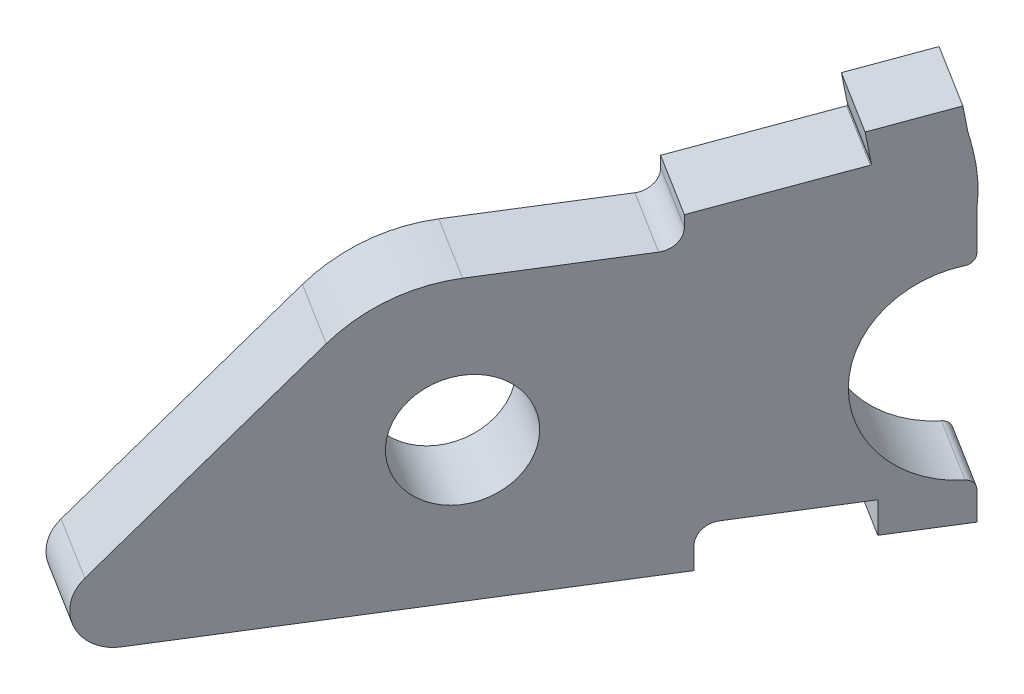
ISO-10303-21;
HEADER;
FILE_DESCRIPTION(('STEP AP214'),'2;1');
FILE_NAME('part.step','',(''),(''),'','','');
FILE_SCHEMA(('AUTOMOTIVE_DESIGN { 1 0 10303 214 1 1 1 1 }'));
ENDSEC;
DATA;
#1=APPLICATION_CONTEXT('core data for automotive mechanical design processes');
#2=APPLICATION_PROTOCOL_DEFINITION('international standard','automotive_design',2000,#1);
#3=PRODUCT_CONTEXT('',#1,'mechanical');
#4=PRODUCT('Part','Part','',(#3));
#5=PRODUCT_RELATED_PRODUCT_CATEGORY('part','',(#4));
#6=PRODUCT_DEFINITION_FORMATION('','',#4);
#7=PRODUCT_DEFINITION_CONTEXT('part definition',#1,'design');
#8=PRODUCT_DEFINITION('design','',#6,#7);
#9=PRODUCT_DEFINITION_SHAPE('','',#8);
#10=(LENGTH_UNIT() NAMED_UNIT(*) SI_UNIT(.MILLI.,.METRE.));
#11=(NAMED_UNIT(*) PLANE_ANGLE_UNIT() SI_UNIT($,.RADIAN.));
#12=(NAMED_UNIT(*) SI_UNIT($,.STERADIAN.) SOLID_ANGLE_UNIT());
#13=UNCERTAINTY_MEASURE_WITH_UNIT(LENGTH_MEASURE(1.E-05),#10,'distance_accuracy_value','');
#14=(GEOMETRIC_REPRESENTATION_CONTEXT(3) GLOBAL_UNCERTAINTY_ASSIGNED_CONTEXT((#13)) GLOBAL_UNIT_ASSIGNED_CONTEXT((#10,
#11,#12)) REPRESENTATION_CONTEXT('',''));
#15=CARTESIAN_POINT('',(0.,0.,0.));
#16=DIRECTION('',(0.,0.,1.));
#17=DIRECTION('',(1.,0.,0.));
#18=AXIS2_PLACEMENT_3D('',#15,#16,#17);
#19=CARTESIAN_POINT('',(-344.76294238982,20.4072042356306,158.663972817058));
#20=DIRECTION('',(-0.523412538698559,-0.156226295448581,0.837635158612354));
#21=DIRECTION('',(0.0827873235379901,-0.987721288932467,-0.132487412424741));
#22=AXIS2_PLACEMENT_3D('',#19,#20,#21);
#23=PLANE('',#22);
#24=DIRECTION('',(0.0827873235379901,-0.987721288932467,-0.132487412424741));
#25=VECTOR('',#24,1.);
#26=CARTESIAN_POINT('',(-351.547327159072,20.4072042356306,154.424618703192));
#27=LINE('',#26,#25);
#28=CARTESIAN_POINT('',(-353.071209475215,38.5883815120178,156.86334019191));
#29=VERTEX_POINT('',#28);
#30=CARTESIAN_POINT('',(-352.85056810026,35.95594729445,156.510240181035));
#31=VERTEX_POINT('',#30);
#32=EDGE_CURVE('E375',#29,#31,#27,.T.);
#33=ORIENTED_EDGE('',*,*,#32,.T.);
#34=DIRECTION('',(0.84804809615643,0.,0.529919264233198));
#35=VECTOR('',#34,1.);
#36=CARTESIAN_POINT('',(-346.066183331008,35.95594729445,160.7495942949));
#37=LINE('',#36,#35);
#38=CARTESIAN_POINT('',(-346.066183331008,35.95594729445,160.7495942949));
#39=VERTEX_POINT('',#38);
#40=EDGE_CURVE('E434',#31,#39,#37,.T.);
#41=ORIENTED_EDGE('',*,*,#40,.T.);
#42=DIRECTION('',(0.0827873235379901,-0.987721288932467,-0.132487412424741));
#43=VECTOR('',#42,1.);
#44=CARTESIAN_POINT('',(-344.76294238982,20.4072042356306,158.663972817058));
#45=LINE('',#44,#43);
#46=CARTESIAN_POINT('',(-346.286824705963,38.5883815120177,161.102694305776));
#47=VERTEX_POINT('',#46);
#48=EDGE_CURVE('E258',#47,#39,#45,.T.);
#49=ORIENTED_EDGE('',*,*,#48,.F.);
#50=DIRECTION('',(0.84804809615643,0.,0.529919264233198));
#51=VECTOR('',#50,1.);
#52=CARTESIAN_POINT('',(-346.286824705963,38.5883815120177,161.102694305776));
#53=LINE('',#52,#51);
#54=EDGE_CURVE('E257',#29,#47,#53,.T.);
#55=ORIENTED_EDGE('',*,*,#54,.F.);
#56=EDGE_LOOP('',(#33,#41,#49,#55));
#57=FACE_BOUND('',#56,.T.);
#58=ADVANCED_FACE('F37',(#57),#23,.T.);
#59=CARTESIAN_POINT('',(-346.429696410204,40.2929591917116,161.331336827295));
#60=DIRECTION('',(0.523284665044902,0.157744371910482,-0.837430517989052));
#61=DIRECTION('',(-0.0835917814997305,0.987479981129019,0.133774814278076));
#62=AXIS2_PLACEMENT_3D('',#59,#60,#61);
#63=PLANE('',#62);
#64=DIRECTION('',(-0.0835917814997305,0.987479981129019,0.133774814278076));
#65=VECTOR('',#64,1.);
#66=CARTESIAN_POINT('',(-353.214081179455,40.2929591917116,157.091982713429));
#67=LINE('',#66,#65);
#68=CARTESIAN_POINT('',(-352.813312544952,35.5586300921784,156.450618829478));
#69=VERTEX_POINT('',#68);
#70=CARTESIAN_POINT('',(-352.814698262123,35.574999739305,156.452836440514));
#71=VERTEX_POINT('',#70);
#72=EDGE_CURVE('E372',#69,#71,#67,.T.);
#73=ORIENTED_EDGE('',*,*,#72,.F.);
#74=DIRECTION('',(-0.848048096156431,0.,-0.529919264233198));
#75=VECTOR('',#74,1.);
#76=CARTESIAN_POINT('',(-346.028927775701,35.5586300921784,160.689972943343));
#77=LINE('',#76,#75);
#78=CARTESIAN_POINT('',(-346.028927775701,35.5586300921784,160.689972943343));
#79=VERTEX_POINT('',#78);
#80=EDGE_CURVE('E420',#69,#79,#77,.F.);
#81=ORIENTED_EDGE('',*,*,#80,.T.);
#82=DIRECTION('',(-0.0835917814997305,0.987479981129019,0.133774814278076));
#83=VECTOR('',#82,1.);
#84=CARTESIAN_POINT('',(-346.429696410204,40.2929591917116,161.331336827295));
#85=LINE('',#84,#83);
#86=CARTESIAN_POINT('',(-346.030313492872,35.574999739305,160.692190554379));
#87=VERTEX_POINT('',#86);
#88=EDGE_CURVE('E260',#79,#87,#85,.T.);
#89=ORIENTED_EDGE('',*,*,#88,.T.);
#90=DIRECTION('',(-0.848048096156431,0.,-0.529919264233198));
#91=VECTOR('',#90,1.);
#92=CARTESIAN_POINT('',(-352.814698262123,35.574999739305,156.452836440514));
#93=LINE('',#92,#91);
#94=EDGE_CURVE('E418',#87,#71,#93,.T.);
#95=ORIENTED_EDGE('',*,*,#94,.T.);
#96=EDGE_LOOP('',(#73,#81,#89,#95));
#97=FACE_BOUND('',#96,.T.);
#98=ADVANCED_FACE('F504',(#97),#63,.F.);
#99=CARTESIAN_POINT('',(-346.020555738474,35.4597301882154,160.676574883091));
#100=DIRECTION('',(0.0827873235379969,-0.987721288932464,-0.132487412424752));
#101=DIRECTION('',(0.523412538698558,0.156226295448594,-0.837635158612352));
#102=AXIS2_PLACEMENT_3D('',#99,#100,#101);
#103=PLANE('',#102);
#104=DIRECTION('',(0.523412538698558,0.156226295448594,-0.837635158612352));
#105=VECTOR('',#104,1.);
#106=CARTESIAN_POINT('',(-346.020555738474,35.4597301882154,160.676574883091));
#107=LINE('',#106,#105);
#108=CARTESIAN_POINT('',(-353.737484478112,33.1564090025366,173.026242403282));
#109=VERTEX_POINT('',#108);
#110=CARTESIAN_POINT('',(-346.072977509851,35.4440835260941,160.7604672539));
#111=VERTEX_POINT('',#110);
#112=EDGE_CURVE('E266',#109,#111,#107,.T.);
#113=ORIENTED_EDGE('',*,*,#112,.T.);
#114=DIRECTION('',(-0.848048096156431,0.,-0.529919264233198));
#115=VECTOR('',#114,1.);
#116=CARTESIAN_POINT('',(-352.857362279103,35.4440835260941,156.521113140034));
#117=LINE('',#116,#115);
#118=CARTESIAN_POINT('',(-352.857362279103,35.4440835260941,156.521113140034));
#119=VERTEX_POINT('',#118);
#120=EDGE_CURVE('E423',#111,#119,#117,.T.);
#121=ORIENTED_EDGE('',*,*,#120,.T.);
#122=DIRECTION('',(0.523412538698558,0.156226295448594,-0.837635158612352));
#123=VECTOR('',#122,1.);
#124=CARTESIAN_POINT('',(-352.804940507726,35.4597301882154,156.437220769226));
#125=LINE('',#124,#123);
#126=CARTESIAN_POINT('',(-360.521869247363,33.1564090025367,168.786888289417));
#127=VERTEX_POINT('',#126);
#128=EDGE_CURVE('E369',#127,#119,#125,.T.);
#129=ORIENTED_EDGE('',*,*,#128,.F.);
#130=DIRECTION('',(0.84804809615643,0.,0.529919264233198));
#131=VECTOR('',#130,1.);
#132=CARTESIAN_POINT('',(-353.737484478112,33.1564090025366,173.026242403282));
#133=LINE('',#132,#131);
#134=EDGE_CURVE('E408',#127,#109,#133,.T.);
#135=ORIENTED_EDGE('',*,*,#134,.T.);
#136=EDGE_LOOP('',(#113,#121,#129,#135));
#137=FACE_BOUND('',#136,.T.);
#138=ADVANCED_FACE('F514',(#137),#103,.F.);
#139=CARTESIAN_POINT('',(-353.737484478112,33.1564090025366,173.026242403282));
#140=DIRECTION('',(0.529919264233198,0.,-0.84804809615643));
#141=DIRECTION('',(0.,1.,0.));
#142=AXIS2_PLACEMENT_3D('',#139,#140,#141);
#143=PLANE('',#142);
#144=ORIENTED_EDGE('',*,*,#134,.F.);
#145=DIRECTION('',(0.,1.,0.));
#146=VECTOR('',#145,1.);
#147=CARTESIAN_POINT('',(-360.521869247363,15.,168.786888289417));
#148=LINE('',#147,#146);
#149=CARTESIAN_POINT('',(-360.521869247363,32.,168.786888289417));
#150=VERTEX_POINT('',#149);
#151=EDGE_CURVE('E366',#150,#127,#148,.T.);
#152=ORIENTED_EDGE('',*,*,#151,.F.);
#153=DIRECTION('',(0.84804809615643,0.,0.529919264233198));
#154=VECTOR('',#153,1.);
#155=CARTESIAN_POINT('',(-353.737484478112,32.,173.026242403282));
#156=LINE('',#155,#154);
#157=CARTESIAN_POINT('',(-353.737484478112,32.,173.026242403282));
#158=VERTEX_POINT('',#157);
#159=EDGE_CURVE('E406',#150,#158,#156,.T.);
#160=ORIENTED_EDGE('',*,*,#159,.T.);
#161=DIRECTION('',(0.,1.,0.));
#162=VECTOR('',#161,1.);
#163=CARTESIAN_POINT('',(-353.737484478112,33.1564090025366,173.026242403282));
#164=LINE('',#163,#162);
#165=EDGE_CURVE('E269',#158,#109,#164,.T.);
#166=ORIENTED_EDGE('',*,*,#165,.T.);
#167=EDGE_LOOP('',(#144,#152,#160,#166));
#168=FACE_BOUND('',#167,.T.);
#169=ADVANCED_FACE('F517',(#168),#143,.F.);
#170=CARTESIAN_POINT('',(-354.797323006578,32.,174.722338595595));
#171=DIRECTION('',(0.84804809615643,0.,0.529919264233198));
#172=DIRECTION('',(0.529919264233198,0.,-0.84804809615643));
#173=AXIS2_PLACEMENT_3D('',#170,#171,#172);
#174=CYLINDRICAL_SURFACE('',#173,2.);
#175=ORIENTED_EDGE('',*,*,#159,.F.);
#176=CARTESIAN_POINT('',(-361.581707775829,32.,170.482984481729));
#177=DIRECTION('',(0.84804809615643,0.,0.529919264233198));
#178=DIRECTION('',(0.529919264233198,0.,-0.84804809615643));
#179=AXIS2_PLACEMENT_3D('',#176,#177,#178);
#180=CIRCLE('',#179,2.);
#181=CARTESIAN_POINT('',(-361.581707775829,30.,170.482984481729));
#182=VERTEX_POINT('',#181);
#183=EDGE_CURVE('E363',#150,#182,#180,.F.);
#184=ORIENTED_EDGE('',*,*,#183,.T.);
#185=DIRECTION('',(0.84804809615643,0.,0.529919264233198));
#186=VECTOR('',#185,1.);
#187=CARTESIAN_POINT('',(-354.797323006578,30.,174.722338595595));
#188=LINE('',#187,#186);
#189=CARTESIAN_POINT('',(-354.797323006578,30.,174.722338595595));
#190=VERTEX_POINT('',#189);
#191=EDGE_CURVE('E404',#182,#190,#188,.T.);
#192=ORIENTED_EDGE('',*,*,#191,.T.);
#193=CARTESIAN_POINT('',(-354.797323006578,32.,174.722338595595));
#194=DIRECTION('',(0.84804809615643,0.,0.529919264233198));
#195=DIRECTION('',(0.529919264233198,0.,-0.84804809615643));
#196=AXIS2_PLACEMENT_3D('',#193,#194,#195);
#197=CIRCLE('',#196,2.);
#198=EDGE_CURVE('E272',#158,#190,#197,.F.);
#199=ORIENTED_EDGE('',*,*,#198,.F.);
#200=EDGE_LOOP('',(#175,#184,#192,#199));
#201=FACE_BOUND('',#200,.T.);
#202=ADVANCED_FACE('F522',(#201),#174,.F.);
#203=CARTESIAN_POINT('',(-341.682190561809,30.,153.733739291285));
#204=DIRECTION('',(0.,1.,0.));
#205=DIRECTION('',(-0.529919264233199,0.,0.84804809615643));
#206=AXIS2_PLACEMENT_3D('',#203,#204,#205);
#207=PLANE('',#206);
#208=ORIENTED_EDGE('',*,*,#191,.F.);
#209=DIRECTION('',(0.529919264233198,0.,-0.84804809615643));
#210=VECTOR('',#209,1.);
#211=CARTESIAN_POINT('',(-369.663345900389,30.,183.416309023677));
#212=LINE('',#211,#210);
#213=CARTESIAN_POINT('',(-369.663345900389,30.,183.416309023677));
#214=VERTEX_POINT('',#213);
#215=EDGE_CURVE('E360',#182,#214,#212,.F.);
#216=ORIENTED_EDGE('',*,*,#215,.T.);
#217=DIRECTION('',(0.84804809615643,0.,0.529919264233198));
#218=VECTOR('',#217,1.);
#219=CARTESIAN_POINT('',(-362.878961131137,30.,187.655663137542));
#220=LINE('',#219,#218);
#221=CARTESIAN_POINT('',(-362.878961131137,30.,187.655663137542));
#222=VERTEX_POINT('',#221);
#223=EDGE_CURVE('E402',#214,#222,#220,.T.);
#224=ORIENTED_EDGE('',*,*,#223,.T.);
#225=DIRECTION('',(-0.529919264233199,0.,0.84804809615643));
#226=VECTOR('',#225,1.);
#227=CARTESIAN_POINT('',(-341.682190561809,30.,153.733739291285));
#228=LINE('',#227,#226);
#229=EDGE_CURVE('E275',#190,#222,#228,.T.);
#230=ORIENTED_EDGE('',*,*,#229,.F.);
#231=EDGE_LOOP('',(#208,#216,#224,#230));
#232=FACE_BOUND('',#231,.T.);
#233=ADVANCED_FACE('F527',(#232),#207,.T.);
#234=CARTESIAN_POINT('',(-362.878961131137,15.,187.655663137542));
#235=DIRECTION('',(0.84804809615643,0.,0.529919264233198));
#236=DIRECTION('',(0.529919264233198,0.,-0.84804809615643));
#237=AXIS2_PLACEMENT_3D('',#234,#235,#236);
#238=CYLINDRICAL_SURFACE('',#237,15.);
#239=ORIENTED_EDGE('',*,*,#223,.F.);
#240=CARTESIAN_POINT('',(-369.663345900389,15.,183.416309023677));
#241=DIRECTION('',(0.84804809615643,0.,0.529919264233198));
#242=DIRECTION('',(0.529919264233198,0.,-0.84804809615643));
#243=AXIS2_PLACEMENT_3D('',#240,#241,#242);
#244=CIRCLE('',#243,15.);
#245=CARTESIAN_POINT('',(-375.283988478699,25.6066017177983,192.411217417145));
#246=VERTEX_POINT('',#245);
#247=EDGE_CURVE('E357',#214,#246,#244,.T.);
#248=ORIENTED_EDGE('',*,*,#247,.T.);
#249=DIRECTION('',(0.84804809615643,0.,0.529919264233198));
#250=VECTOR('',#249,1.);
#251=CARTESIAN_POINT('',(-368.499603709447,25.6066017177983,196.65057153101));
#252=LINE('',#251,#250);
#253=CARTESIAN_POINT('',(-368.499603709447,25.6066017177983,196.65057153101));
#254=VERTEX_POINT('',#253);
#255=EDGE_CURVE('E400',#246,#254,#252,.T.);
#256=ORIENTED_EDGE('',*,*,#255,.T.);
#257=CARTESIAN_POINT('',(-362.878961131137,15.,187.655663137542));
#258=DIRECTION('',(0.84804809615643,0.,0.529919264233198));
#259=DIRECTION('',(0.529919264233198,0.,-0.84804809615643));
#260=AXIS2_PLACEMENT_3D('',#257,#258,#259);
#261=CIRCLE('',#260,15.);
#262=EDGE_CURVE('E278',#222,#254,#261,.T.);
#263=ORIENTED_EDGE('',*,*,#262,.F.);
#264=EDGE_LOOP('',(#239,#248,#256,#263));
#265=FACE_BOUND('',#264,.T.);
#266=ADVANCED_FACE('F529',(#265),#238,.T.);
#267=CARTESIAN_POINT('',(-368.499603709447,25.6066017177983,196.65057153101));
#268=DIRECTION('',(-0.374709505220678,0.707106781186551,0.59966055956455));
#269=DIRECTION('',(-0.374709505220682,-0.707106781186544,0.599660559564556));
#270=AXIS2_PLACEMENT_3D('',#267,#268,#269);
#271=PLANE('',#270);
#272=ORIENTED_EDGE('',*,*,#255,.F.);
#273=DIRECTION('',(-0.374709505220682,-0.707106781186544,0.599660559564556));
#274=VECTOR('',#273,1.);
#275=CARTESIAN_POINT('',(-375.283988478699,25.6066017177983,192.411217417145));
#276=LINE('',#275,#274);
#277=CARTESIAN_POINT('',(-385.234904942692,6.82842712474622,208.336012630076));
#278=VERTEX_POINT('',#277);
#279=EDGE_CURVE('E354',#246,#278,#276,.T.);
#280=ORIENTED_EDGE('',*,*,#279,.T.);
#281=DIRECTION('',(0.84804809615643,0.,0.529919264233198));
#282=VECTOR('',#281,1.);
#283=CARTESIAN_POINT('',(-378.45052017344,6.82842712474623,212.575366743942));
#284=LINE('',#283,#282);
#285=CARTESIAN_POINT('',(-378.45052017344,6.82842712474623,212.575366743942));
#286=VERTEX_POINT('',#285);
#287=EDGE_CURVE('E398',#278,#286,#284,.T.);
#288=ORIENTED_EDGE('',*,*,#287,.T.);
#289=DIRECTION('',(-0.374709505220682,-0.707106781186544,0.599660559564556));
#290=VECTOR('',#289,1.);
#291=CARTESIAN_POINT('',(-368.499603709447,25.6066017177983,196.65057153101));
#292=LINE('',#291,#290);
#293=EDGE_CURVE('E281',#254,#286,#292,.T.);
#294=ORIENTED_EDGE('',*,*,#293,.F.);
#295=EDGE_LOOP('',(#272,#280,#288,#294));
#296=FACE_BOUND('',#295,.T.);
#297=ADVANCED_FACE('F534',(#296),#271,.T.);
#298=CARTESIAN_POINT('',(-376.951682152558,4.,210.176724505683));
#299=DIRECTION('',(0.84804809615643,0.,0.529919264233198));
#300=DIRECTION('',(0.529919264233198,0.,-0.84804809615643));
#301=AXIS2_PLACEMENT_3D('',#298,#299,#300);
#302=CYLINDRICAL_SURFACE('',#301,4.);
#303=ORIENTED_EDGE('',*,*,#287,.F.);
#304=CARTESIAN_POINT('',(-383.736066921809,4.,205.937370391818));
#305=DIRECTION('',(0.84804809615643,0.,0.529919264233198));
#306=DIRECTION('',(0.529919264233198,0.,-0.84804809615643));
#307=AXIS2_PLACEMENT_3D('',#304,#305,#306);
#308=CIRCLE('',#307,4.);
#309=CARTESIAN_POINT('',(-383.736066921809,0.,205.937370391818));
#310=VERTEX_POINT('',#309);
#311=EDGE_CURVE('E351',#278,#310,#308,.T.);
#312=ORIENTED_EDGE('',*,*,#311,.T.);
#313=DIRECTION('',(0.84804809615643,0.,0.529919264233198));
#314=VECTOR('',#313,1.);
#315=CARTESIAN_POINT('',(-376.951682152558,0.,210.176724505683));
#316=LINE('',#315,#314);
#317=CARTESIAN_POINT('',(-376.951682152558,0.,210.176724505683));
#318=VERTEX_POINT('',#317);
#319=EDGE_CURVE('E396',#310,#318,#316,.T.);
#320=ORIENTED_EDGE('',*,*,#319,.T.);
#321=CARTESIAN_POINT('',(-376.951682152558,4.,210.176724505683));
#322=DIRECTION('',(0.84804809615643,0.,0.529919264233198));
#323=DIRECTION('',(0.529919264233198,0.,-0.84804809615643));
#324=AXIS2_PLACEMENT_3D('',#321,#322,#323);
#325=CIRCLE('',#324,4.);
#326=EDGE_CURVE('E284',#286,#318,#325,.T.);
#327=ORIENTED_EDGE('',*,*,#326,.F.);
#328=EDGE_LOOP('',(#303,#312,#320,#327));
#329=FACE_BOUND('',#328,.T.);
#330=ADVANCED_FACE('F539',(#329),#302,.T.);
#331=CARTESIAN_POINT('',(-382.069035251256,0.,218.366201366826));
#332=DIRECTION('',(0.,-1.,0.));
#333=DIRECTION('',(0.529919264233197,0.,-0.848048096156431));
#334=AXIS2_PLACEMENT_3D('',#331,#332,#333);
#335=PLANE('',#334);
#336=ORIENTED_EDGE('',*,*,#319,.F.);
#337=DIRECTION('',(0.529919264233198,0.,-0.84804809615643));
#338=VECTOR('',#337,1.);
#339=CARTESIAN_POINT('',(-369.663345900389,0.,183.416309023677));
#340=LINE('',#339,#338);
#341=CARTESIAN_POINT('',(-360.124799144191,0.,168.151443292861));
#342=VERTEX_POINT('',#341);
#343=EDGE_CURVE('E348',#310,#342,#340,.T.);
#344=ORIENTED_EDGE('',*,*,#343,.T.);
#345=DIRECTION('',(0.84804809615643,0.,0.529919264233198));
#346=VECTOR('',#345,1.);
#347=CARTESIAN_POINT('',(-353.34041437494,0.,172.390797406726));
#348=LINE('',#347,#346);
#349=CARTESIAN_POINT('',(-353.34041437494,0.,172.390797406726));
#350=VERTEX_POINT('',#349);
#351=EDGE_CURVE('E394',#342,#350,#348,.T.);
#352=ORIENTED_EDGE('',*,*,#351,.T.);
#353=DIRECTION('',(0.529919264233197,0.,-0.848048096156431));
#354=VECTOR('',#353,1.);
#355=CARTESIAN_POINT('',(-382.069035251256,0.,218.366201366826));
#356=LINE('',#355,#354);
#357=EDGE_CURVE('E287',#318,#350,#356,.T.);
#358=ORIENTED_EDGE('',*,*,#357,.F.);
#359=EDGE_LOOP('',(#336,#344,#352,#358));
#360=FACE_BOUND('',#359,.T.);
#361=ADVANCED_FACE('F541',(#360),#335,.T.);
#362=CARTESIAN_POINT('',(-353.34041437494,2.3,172.390797406726));
#363=DIRECTION('',(0.529919264233198,0.,-0.848048096156431));
#364=DIRECTION('',(0.,1.,0.));
#365=AXIS2_PLACEMENT_3D('',#362,#363,#364);
#366=PLANE('',#365);
#367=ORIENTED_EDGE('',*,*,#351,.F.);
#368=DIRECTION('',(0.,1.,0.));
#369=VECTOR('',#368,1.);
#370=CARTESIAN_POINT('',(-360.124799144191,15.,168.151443292861));
#371=LINE('',#370,#369);
#372=CARTESIAN_POINT('',(-360.124799144191,2.29999999999999,168.151443292861));
#373=VERTEX_POINT('',#372);
#374=EDGE_CURVE('E345',#342,#373,#371,.T.);
#375=ORIENTED_EDGE('',*,*,#374,.T.);
#376=DIRECTION('',(0.84804809615643,0.,0.529919264233198));
#377=VECTOR('',#376,1.);
#378=CARTESIAN_POINT('',(-353.34041437494,2.3,172.390797406726));
#379=LINE('',#378,#377);
#380=CARTESIAN_POINT('',(-353.34041437494,2.3,172.390797406726));
#381=VERTEX_POINT('',#380);
#382=EDGE_CURVE('E392',#373,#381,#379,.T.);
#383=ORIENTED_EDGE('',*,*,#382,.T.);
#384=DIRECTION('',(0.,1.,0.));
#385=VECTOR('',#384,1.);
#386=CARTESIAN_POINT('',(-353.34041437494,2.3,172.390797406726));
#387=LINE('',#386,#385);
#388=EDGE_CURVE('E290',#350,#381,#387,.T.);
#389=ORIENTED_EDGE('',*,*,#388,.F.);
#390=EDGE_LOOP('',(#367,#375,#383,#389));
#391=FACE_BOUND('',#390,.T.);
#392=ADVANCED_FACE('F546',(#391),#366,.T.);
#393=CARTESIAN_POINT('',(-352.280575846473,2.3,170.694701214414));
#394=DIRECTION('',(-0.84804809615643,0.,-0.529919264233198));
#395=DIRECTION('',(-0.529919264233198,0.,0.84804809615643));
#396=AXIS2_PLACEMENT_3D('',#393,#394,#395);
#397=CYLINDRICAL_SURFACE('',#396,2.00000000000001);
#398=ORIENTED_EDGE('',*,*,#382,.F.);
#399=CARTESIAN_POINT('',(-359.064960615725,2.3,166.455347100548));
#400=DIRECTION('',(-0.84804809615643,0.,-0.529919264233198));
#401=DIRECTION('',(-0.529919264233198,0.,0.84804809615643));
#402=AXIS2_PLACEMENT_3D('',#399,#400,#401);
#403=CIRCLE('',#402,2.00000000000001);
#404=CARTESIAN_POINT('',(-359.064960615725,4.3,166.455347100548));
#405=VERTEX_POINT('',#404);
#406=EDGE_CURVE('E342',#373,#405,#403,.T.);
#407=ORIENTED_EDGE('',*,*,#406,.T.);
#408=DIRECTION('',(0.84804809615643,0.,0.529919264233198));
#409=VECTOR('',#408,1.);
#410=CARTESIAN_POINT('',(-352.280575846473,4.3,170.694701214414));
#411=LINE('',#410,#409);
#412=CARTESIAN_POINT('',(-352.280575846473,4.3,170.694701214414));
#413=VERTEX_POINT('',#412);
#414=EDGE_CURVE('E390',#405,#413,#411,.T.);
#415=ORIENTED_EDGE('',*,*,#414,.T.);
#416=CARTESIAN_POINT('',(-352.280575846473,2.3,170.694701214414));
#417=DIRECTION('',(-0.84804809615643,0.,-0.529919264233198));
#418=DIRECTION('',(0.529919264233198,0.,-0.84804809615643));
#419=AXIS2_PLACEMENT_3D('',#416,#417,#418);
#420=CIRCLE('',#419,2.00000000000001);
#421=EDGE_CURVE('E293',#381,#413,#420,.T.);
#422=ORIENTED_EDGE('',*,*,#421,.F.);
#423=EDGE_LOOP('',(#398,#407,#415,#422));
#424=FACE_BOUND('',#423,.T.);
#425=ADVANCED_FACE('F551',(#424),#397,.F.);
#426=CARTESIAN_POINT('',(-362.878961131137,4.3,187.655663137542));
#427=DIRECTION('',(0.,-1.,0.));
#428=DIRECTION('',(0.529919264233198,0.,-0.84804809615643));
#429=AXIS2_PLACEMENT_3D('',#426,#427,#428);
#430=PLANE('',#429);
#431=ORIENTED_EDGE('',*,*,#414,.F.);
#432=DIRECTION('',(0.529919264233198,0.,-0.84804809615643));
#433=VECTOR('',#432,1.);
#434=CARTESIAN_POINT('',(-369.663345900389,4.3,183.416309023677));
#435=LINE('',#434,#433);
#436=CARTESIAN_POINT('',(-352.546953665656,4.3,156.024355517824));
#437=VERTEX_POINT('',#436);
#438=EDGE_CURVE('E339',#405,#437,#435,.T.);
#439=ORIENTED_EDGE('',*,*,#438,.T.);
#440=DIRECTION('',(0.84804809615643,0.,0.529919264233198));
#441=VECTOR('',#440,1.);
#442=CARTESIAN_POINT('',(-345.762568896405,4.3,160.26370963169));
#443=LINE('',#442,#441);
#444=CARTESIAN_POINT('',(-345.762568896405,4.3,160.26370963169));
#445=VERTEX_POINT('',#444);
#446=EDGE_CURVE('E388',#437,#445,#443,.T.);
#447=ORIENTED_EDGE('',*,*,#446,.T.);
#448=DIRECTION('',(0.529919264233198,0.,-0.84804809615643));
#449=VECTOR('',#448,1.);
#450=CARTESIAN_POINT('',(-362.878961131137,4.3,187.655663137542));
#451=LINE('',#450,#449);
#452=EDGE_CURVE('E296',#413,#445,#451,.T.);
#453=ORIENTED_EDGE('',*,*,#452,.F.);
#454=EDGE_LOOP('',(#431,#439,#447,#453));
#455=FACE_BOUND('',#454,.T.);
#456=ADVANCED_FACE('F553',(#455),#430,.T.);
#457=CARTESIAN_POINT('',(-345.762568896405,4.3,160.26370963169));
#458=DIRECTION('',(-0.529919264233198,0.,0.848048096156431));
#459=DIRECTION('',(0.,-1.,0.));
#460=AXIS2_PLACEMENT_3D('',#457,#458,#459);
#461=PLANE('',#460);
#462=ORIENTED_EDGE('',*,*,#446,.F.);
#463=DIRECTION('',(0.,1.,0.));
#464=VECTOR('',#463,1.);
#465=CARTESIAN_POINT('',(-352.546953665656,15.,156.024355517824));
#466=LINE('',#465,#464);
#467=CARTESIAN_POINT('',(-352.546953665656,0.999999999999994,156.024355517824));
#468=VERTEX_POINT('',#467);
#469=EDGE_CURVE('E336',#437,#468,#466,.F.);
#470=ORIENTED_EDGE('',*,*,#469,.T.);
#471=DIRECTION('',(0.84804809615643,0.,0.529919264233198));
#472=VECTOR('',#471,1.);
#473=CARTESIAN_POINT('',(-345.762568896405,1.,160.26370963169));
#474=LINE('',#473,#472);
#475=CARTESIAN_POINT('',(-345.762568896405,1.,160.26370963169));
#476=VERTEX_POINT('',#475);
#477=EDGE_CURVE('E386',#468,#476,#474,.T.);
#478=ORIENTED_EDGE('',*,*,#477,.T.);
#479=DIRECTION('',(0.,-1.,0.));
#480=VECTOR('',#479,1.);
#481=CARTESIAN_POINT('',(-345.762568896405,4.3,160.26370963169));
#482=LINE('',#481,#480);
#483=EDGE_CURVE('E299',#445,#476,#482,.T.);
#484=ORIENTED_EDGE('',*,*,#483,.F.);
#485=EDGE_LOOP('',(#462,#470,#478,#484));
#486=FACE_BOUND('',#485,.T.);
#487=ADVANCED_FACE('F557',(#486),#461,.T.);
#488=CARTESIAN_POINT('',(-362.878961131137,1.,187.655663137542));
#489=DIRECTION('',(0.,-1.,0.));
#490=DIRECTION('',(0.529919264233198,0.,-0.84804809615643));
#491=AXIS2_PLACEMENT_3D('',#488,#489,#490);
#492=PLANE('',#491);
#493=ORIENTED_EDGE('',*,*,#477,.F.);
#494=DIRECTION('',(0.529919264233198,0.,-0.84804809615643));
#495=VECTOR('',#494,1.);
#496=CARTESIAN_POINT('',(-369.663345900389,0.999999999999994,183.416309023677));
#497=LINE('',#496,#495);
#498=CARTESIAN_POINT('',(-348.466575331061,0.999999999999994,149.494385177419));
#499=VERTEX_POINT('',#498);
#500=EDGE_CURVE('E333',#468,#499,#497,.T.);
#501=ORIENTED_EDGE('',*,*,#500,.T.);
#502=DIRECTION('',(0.84804809615643,0.,0.529919264233198));
#503=VECTOR('',#502,1.);
#504=CARTESIAN_POINT('',(-341.682190561809,1.,153.733739291285));
#505=LINE('',#504,#503);
#506=CARTESIAN_POINT('',(-341.682190561809,1.,153.733739291285));
#507=VERTEX_POINT('',#506);
#508=EDGE_CURVE('E384',#499,#507,#505,.T.);
#509=ORIENTED_EDGE('',*,*,#508,.T.);
#510=DIRECTION('',(0.529919264233198,0.,-0.84804809615643));
#511=VECTOR('',#510,1.);
#512=CARTESIAN_POINT('',(-362.878961131137,1.,187.655663137542));
#513=LINE('',#512,#511);
#514=EDGE_CURVE('E302',#476,#507,#513,.T.);
#515=ORIENTED_EDGE('',*,*,#514,.F.);
#516=EDGE_LOOP('',(#493,#501,#509,#515));
#517=FACE_BOUND('',#516,.T.);
#518=ADVANCED_FACE('F562',(#517),#492,.T.);
#519=CARTESIAN_POINT('',(-341.682190561809,0.,153.733739291285));
#520=DIRECTION('',(0.529919264233198,0.,-0.84804809615643));
#521=DIRECTION('',(0.,1.,0.));
#522=AXIS2_PLACEMENT_3D('',#519,#520,#521);
#523=PLANE('',#522);
#524=DIRECTION('',(0.,1.,0.));
#525=VECTOR('',#524,1.);
#526=CARTESIAN_POINT('',(-348.466575331061,15.,149.494385177419));
#527=LINE('',#526,#525);
#528=CARTESIAN_POINT('',(-348.466575331061,4.04554884989667,149.494385177419));
#529=VERTEX_POINT('',#528);
#530=EDGE_CURVE('E331',#499,#529,#527,.T.);
#531=ORIENTED_EDGE('',*,*,#530,.T.);
#532=DIRECTION('',(-0.84804809615643,0.,-0.529919264233198));
#533=VECTOR('',#532,1.);
#534=CARTESIAN_POINT('',(-341.682190561809,4.04554884989667,153.733739291285));
#535=LINE('',#534,#533);
#536=CARTESIAN_POINT('',(-341.682190561809,4.04554884989667,153.733739291285));
#537=VERTEX_POINT('',#536);
#538=EDGE_CURVE('E11',#529,#537,#535,.F.);
#539=ORIENTED_EDGE('',*,*,#538,.T.);
#540=DIRECTION('',(0.,1.,0.));
#541=VECTOR('',#540,1.);
#542=CARTESIAN_POINT('',(-341.682190561809,0.,153.733739291285));
#543=LINE('',#542,#541);
#544=EDGE_CURVE('E305',#507,#537,#543,.T.);
#545=ORIENTED_EDGE('',*,*,#544,.F.);
#546=ORIENTED_EDGE('',*,*,#508,.F.);
#547=EDGE_LOOP('',(#531,#539,#545,#546));
#548=FACE_BOUND('',#547,.T.);
#549=ADVANCED_FACE('F564',(#548),#523,.T.);
#550=CARTESIAN_POINT('',(-341.682190561809,15.,153.733739291285));
#551=DIRECTION('',(-0.84804809615643,0.,-0.529919264233198));
#552=DIRECTION('',(-0.529919264233198,0.,0.84804809615643));
#553=AXIS2_PLACEMENT_3D('',#550,#551,#552);
#554=CYLINDRICAL_SURFACE('',#553,10.);
#555=CARTESIAN_POINT('',(-348.466575331061,15.,149.494385177419));
#556=DIRECTION('',(-0.84804809615643,0.,-0.529919264233198));
#557=DIRECTION('',(-0.529919264233198,0.,0.84804809615643));
#558=AXIS2_PLACEMENT_3D('',#555,#556,#557);
#559=CIRCLE('',#558,10.);
#560=CARTESIAN_POINT('',(-348.948320116727,5.04140804536062,150.265337992107));
#561=VERTEX_POINT('',#560);
#562=CARTESIAN_POINT('',(-348.948320116727,24.9585919546394,150.265337992107));
#563=VERTEX_POINT('',#562);
#564=EDGE_CURVE('E328',#561,#563,#559,.T.);
#565=ORIENTED_EDGE('',*,*,#564,.T.);
#566=DIRECTION('',(-0.84804809615643,0.,-0.529919264233198));
#567=VECTOR('',#566,1.);
#568=CARTESIAN_POINT('',(-342.163935347476,24.9585919546394,154.504692105973));
#569=LINE('',#568,#567);
#570=CARTESIAN_POINT('',(-342.163935347476,24.9585919546394,154.504692105973));
#571=VERTEX_POINT('',#570);
#572=EDGE_CURVE('E453',#563,#571,#569,.F.);
#573=ORIENTED_EDGE('',*,*,#572,.T.);
#574=CARTESIAN_POINT('',(-341.682190561809,15.,153.733739291285));
#575=DIRECTION('',(-0.84804809615643,0.,-0.529919264233198));
#576=DIRECTION('',(0.529919264233198,0.,-0.84804809615643));
#577=AXIS2_PLACEMENT_3D('',#574,#575,#576);
#578=CIRCLE('',#577,10.);
#579=CARTESIAN_POINT('',(-342.163935347476,5.04140804536062,154.504692105973));
#580=VERTEX_POINT('',#579);
#581=EDGE_CURVE('E308',#580,#571,#578,.T.);
#582=ORIENTED_EDGE('',*,*,#581,.F.);
#583=DIRECTION('',(-0.84804809615643,0.,-0.529919264233198));
#584=VECTOR('',#583,1.);
#585=CARTESIAN_POINT('',(-342.163935347476,5.04140804536062,154.504692105973));
#586=LINE('',#585,#584);
#587=EDGE_CURVE('E451',#580,#561,#586,.T.);
#588=ORIENTED_EDGE('',*,*,#587,.T.);
#589=EDGE_LOOP('',(#565,#573,#582,#588));
#590=FACE_BOUND('',#589,.T.);
#591=ADVANCED_FACE('F467',(#590),#554,.F.);
#592=CARTESIAN_POINT('',(-341.682190561809,25.,153.733739291285));
#593=DIRECTION('',(0.529919264233198,0.,-0.84804809615643));
#594=DIRECTION('',(0.,1.,0.));
#595=AXIS2_PLACEMENT_3D('',#592,#593,#594);
#596=PLANE('',#595);
#597=DIRECTION('',(0.,1.,0.));
#598=VECTOR('',#597,1.);
#599=CARTESIAN_POINT('',(-341.682190561809,25.,153.733739291285));
#600=LINE('',#599,#598);
#601=CARTESIAN_POINT('',(-341.682190561809,25.9544511501033,153.733739291285));
#602=VERTEX_POINT('',#601);
#603=CARTESIAN_POINT('',(-341.682190561809,30.,153.733739291285));
#604=VERTEX_POINT('',#603);
#605=EDGE_CURVE('E310',#602,#604,#600,.T.);
#606=ORIENTED_EDGE('',*,*,#605,.F.);
#607=DIRECTION('',(-0.84804809615643,0.,-0.529919264233198));
#608=VECTOR('',#607,1.);
#609=CARTESIAN_POINT('',(-341.682190561809,25.9544511501033,153.733739291285));
#610=LINE('',#609,#608);
#611=CARTESIAN_POINT('',(-348.466575331061,25.9544511501033,149.494385177419));
#612=VERTEX_POINT('',#611);
#613=EDGE_CURVE('E60',#602,#612,#610,.T.);
#614=ORIENTED_EDGE('',*,*,#613,.T.);
#615=DIRECTION('',(0.,1.,0.));
#616=VECTOR('',#615,1.);
#617=CARTESIAN_POINT('',(-348.466575331061,15.,149.494385177419));
#618=LINE('',#617,#616);
#619=CARTESIAN_POINT('',(-348.466575331061,30.,149.494385177419));
#620=VERTEX_POINT('',#619);
#621=EDGE_CURVE('E326',#612,#620,#618,.T.);
#622=ORIENTED_EDGE('',*,*,#621,.T.);
#623=DIRECTION('',(0.84804809615643,0.,0.529919264233198));
#624=VECTOR('',#623,1.);
#625=CARTESIAN_POINT('',(-341.682190561809,30.,153.733739291285));
#626=LINE('',#625,#624);
#627=EDGE_CURVE('E381',#620,#604,#626,.T.);
#628=ORIENTED_EDGE('',*,*,#627,.T.);
#629=EDGE_LOOP('',(#606,#614,#622,#628));
#630=FACE_BOUND('',#629,.T.);
#631=ADVANCED_FACE('F471',(#630),#596,.T.);
#632=CARTESIAN_POINT('',(-351.17078280046,31.8397737672096,168.918661082789));
#633=DIRECTION('',(0.84804809615643,0.,0.529919264233198));
#634=DIRECTION('',(0.529919264233198,0.,-0.84804809615643));
#635=AXIS2_PLACEMENT_3D('',#632,#633,#634);
#636=CYLINDRICAL_SURFACE('',#635,18.);
#637=ORIENTED_EDGE('',*,*,#627,.F.);
#638=CARTESIAN_POINT('',(-357.955167569712,31.8397737672096,164.679306968924));
#639=DIRECTION('',(0.84804809615643,0.,0.529919264233198));
#640=DIRECTION('',(0.529919264233198,0.,-0.84804809615643));
#641=AXIS2_PLACEMENT_3D('',#638,#639,#640);
#642=CIRCLE('',#641,18.);
#643=CARTESIAN_POINT('',(-348.630863466569,35.6333334982734,149.757301153385));
#644=VERTEX_POINT('',#643);
#645=EDGE_CURVE('E323',#620,#644,#642,.T.);
#646=ORIENTED_EDGE('',*,*,#645,.T.);
#647=DIRECTION('',(0.84804809615643,0.,0.529919264233198));
#648=VECTOR('',#647,1.);
#649=CARTESIAN_POINT('',(-341.846478697318,35.6333334982734,153.996655267251));
#650=LINE('',#649,#648);
#651=CARTESIAN_POINT('',(-341.846478697318,35.6333334982734,153.996655267251));
#652=VERTEX_POINT('',#651);
#653=EDGE_CURVE('E253',#644,#652,#650,.T.);
#654=ORIENTED_EDGE('',*,*,#653,.T.);
#655=CARTESIAN_POINT('',(-351.17078280046,31.8397737672096,168.918661082789));
#656=DIRECTION('',(0.84804809615643,0.,0.529919264233198));
#657=DIRECTION('',(0.529919264233198,0.,-0.84804809615643));
#658=AXIS2_PLACEMENT_3D('',#655,#656,#657);
#659=CIRCLE('',#658,18.);
#660=EDGE_CURVE('E312',#604,#652,#659,.T.);
#661=ORIENTED_EDGE('',*,*,#660,.F.);
#662=EDGE_LOOP('',(#637,#646,#654,#661));
#663=FACE_BOUND('',#662,.T.);
#664=ADVANCED_FACE('F475',(#663),#636,.T.);
#665=CARTESIAN_POINT('',(-341.202879675187,30.,152.966681529278));
#666=DIRECTION('',(-0.518016894619037,-0.210753318392428,0.829000323085479));
#667=DIRECTION('',(0.11168224341722,-0.977539277362593,-0.178728950421349));
#668=AXIS2_PLACEMENT_3D('',#665,#666,#667);
#669=PLANE('',#668);
#670=DIRECTION('',(0.11168224341722,-0.977539277362593,-0.178728950421349));
#671=VECTOR('',#670,1.);
#672=CARTESIAN_POINT('',(-347.987264444439,30.,148.727327415413));
#673=LINE('',#672,#671);
#674=CARTESIAN_POINT('',(-348.73960873363,36.5851658265516,149.931329959132));
#675=VERTEX_POINT('',#674);
#676=EDGE_CURVE('E321',#675,#644,#673,.T.);
#677=ORIENTED_EDGE('',*,*,#676,.F.);
#678=DIRECTION('',(-0.84804809615643,0.,-0.529919264233198));
#679=VECTOR('',#678,1.);
#680=CARTESIAN_POINT('',(-341.955223964378,36.5851658265516,154.170684072998));
#681=LINE('',#680,#679);
#682=CARTESIAN_POINT('',(-341.955223964378,36.5851658265516,154.170684072998));
#683=VERTEX_POINT('',#682);
#684=EDGE_CURVE('E410',#675,#683,#681,.F.);
#685=ORIENTED_EDGE('',*,*,#684,.T.);
#686=DIRECTION('',(0.11168224341722,-0.977539277362593,-0.178728950421349));
#687=VECTOR('',#686,1.);
#688=CARTESIAN_POINT('',(-341.202879675187,30.,152.966681529278));
#689=LINE('',#688,#687);
#690=EDGE_CURVE('E254',#683,#652,#689,.T.);
#691=ORIENTED_EDGE('',*,*,#690,.T.);
#692=ORIENTED_EDGE('',*,*,#653,.F.);
#693=EDGE_LOOP('',(#677,#685,#691,#692));
#694=FACE_BOUND('',#693,.T.);
#695=ADVANCED_FACE('F480',(#694),#669,.F.);
#696=CARTESIAN_POINT('',(-291.73863032192,-562.935238981199,73.8073353361443));
#697=DIRECTION('',(0.523412538698559,0.156226295448581,-0.837635158612354));
#698=DIRECTION('',(-0.0827873235379875,0.987721288932466,0.132487412424742));
#699=AXIS2_PLACEMENT_3D('',#696,#697,#698);
#700=PLANE('',#699);
#701=DIRECTION('',(-0.0827873235379875,0.987721288932466,0.132487412424742));
#702=VECTOR('',#701,1.);
#703=CARTESIAN_POINT('',(-291.73863032192,-562.935238981199,73.8073353361443));
#704=LINE('',#703,#702);
#705=CARTESIAN_POINT('',(-342.079902207768,37.6777996897941,154.370210970915));
#706=VERTEX_POINT('',#705);
#707=CARTESIAN_POINT('',(-342.258017869071,39.8028669469762,154.65525561386));
#708=VERTEX_POINT('',#707);
#709=EDGE_CURVE('E231',#706,#708,#704,.T.);
#710=ORIENTED_EDGE('',*,*,#709,.F.);
#711=DIRECTION('',(0.84804809615643,0.,0.529919264233198));
#712=VECTOR('',#711,1.);
#713=CARTESIAN_POINT('',(-348.86428697702,37.6777996897943,150.130856857049));
#714=LINE('',#713,#712);
#715=CARTESIAN_POINT('',(-348.86428697702,37.6777996897942,150.130856857049));
#716=VERTEX_POINT('',#715);
#717=EDGE_CURVE('E446',#706,#716,#714,.F.);
#718=ORIENTED_EDGE('',*,*,#717,.T.);
#719=DIRECTION('',(-0.0827873235379875,0.987721288932466,0.132487412424742));
#720=VECTOR('',#719,1.);
#721=CARTESIAN_POINT('',(-298.523015091172,-562.935238981199,69.5679812222787));
#722=LINE('',#721,#720);
#723=CARTESIAN_POINT('',(-349.042402638322,39.8028669469762,150.415901499994));
#724=VERTEX_POINT('',#723);
#725=EDGE_CURVE('E249',#716,#724,#722,.T.);
#726=ORIENTED_EDGE('',*,*,#725,.T.);
#727=DIRECTION('',(0.84804809615643,0.,0.529919264233198));
#728=VECTOR('',#727,1.);
#729=CARTESIAN_POINT('',(-342.258017869071,39.8028669469762,154.65525561386));
#730=LINE('',#729,#728);
#731=EDGE_CURVE('E246',#724,#708,#730,.T.);
#732=ORIENTED_EDGE('',*,*,#731,.T.);
#733=EDGE_LOOP('',(#710,#718,#726,#732));
#734=FACE_BOUND('',#733,.T.);
#735=ADVANCED_FACE('F247',(#734),#700,.T.);
#736=CARTESIAN_POINT('',(-362.878961131137,15.,187.655663137542));
#737=DIRECTION('',(0.84804809615643,0.,0.529919264233198));
#738=DIRECTION('',(0.529919264233198,0.,-0.84804809615643));
#739=AXIS2_PLACEMENT_3D('',#736,#737,#738);
#740=CYLINDRICAL_SURFACE('',#739,5.99999999999997);
#741=CARTESIAN_POINT('',(-362.878961131137,15.,187.655663137542));
#742=DIRECTION('',(0.84804809615643,0.,0.529919264233198));
#743=DIRECTION('',(0.529919264233198,0.,-0.84804809615643));
#744=AXIS2_PLACEMENT_3D('',#741,#742,#743);
#745=CIRCLE('',#744,5.99999999999997);
#746=CARTESIAN_POINT('',(-359.699445545738,15.,182.567374560604));
#747=VERTEX_POINT('',#746);
#748=EDGE_CURVE('E243',#747,#747,#745,.T.);
#749=ORIENTED_EDGE('',*,*,#748,.T.);
#750=EDGE_LOOP('',(#749));
#751=FACE_BOUND('',#750,.T.);
#752=CARTESIAN_POINT('',(-369.663345900389,15.,183.416309023677));
#753=DIRECTION('',(0.84804809615643,0.,0.529919264233198));
#754=DIRECTION('',(0.529919264233198,0.,-0.84804809615643));
#755=AXIS2_PLACEMENT_3D('',#752,#753,#754);
#756=CIRCLE('',#755,5.99999999999997);
#757=CARTESIAN_POINT('',(-366.48383031499,15.,178.328020446738));
#758=VERTEX_POINT('',#757);
#759=EDGE_CURVE('E316',#758,#758,#756,.T.);
#760=ORIENTED_EDGE('',*,*,#759,.F.);
#761=EDGE_LOOP('',(#760));
#762=FACE_BOUND('',#761,.T.);
#763=ADVANCED_FACE('F581',(#751,#762),#740,.F.);
#764=CARTESIAN_POINT('',(-364.413202165455,33.1241777652595,190.110962040633));
#765=DIRECTION('',(-0.0835917814997177,0.987479981129023,0.133774814278056));
#766=DIRECTION('',(-0.523284665044904,-0.157744371910458,0.837430517989055));
#767=AXIS2_PLACEMENT_3D('',#764,#765,#766);
#768=PLANE('',#767);
#769=DIRECTION('',(-0.523284665044904,-0.157744371910458,0.837430517989055));
#770=VECTOR('',#769,1.);
#771=CARTESIAN_POINT('',(-371.197586934707,33.1241777652595,185.871607926767));
#772=LINE('',#771,#770);
#773=EDGE_CURVE('E320',#724,#29,#772,.T.);
#774=ORIENTED_EDGE('',*,*,#773,.T.);
#775=ORIENTED_EDGE('',*,*,#54,.T.);
#776=DIRECTION('',(-0.523284665044904,-0.157744371910458,0.837430517989055));
#777=VECTOR('',#776,1.);
#778=CARTESIAN_POINT('',(-364.413202165455,33.1241777652595,190.110962040633));
#779=LINE('',#778,#777);
#780=EDGE_CURVE('E237',#708,#47,#779,.T.);
#781=ORIENTED_EDGE('',*,*,#780,.F.);
#782=ORIENTED_EDGE('',*,*,#731,.F.);
#783=EDGE_LOOP('',(#774,#775,#781,#782));
#784=FACE_BOUND('',#783,.T.);
#785=ADVANCED_FACE('F256',(#784),#768,.T.);
#786=CARTESIAN_POINT('',(-362.878961131137,15.,187.655663137542));
#787=DIRECTION('',(0.84804809615643,0.,0.529919264233198));
#788=DIRECTION('',(0.529919264233198,0.,-0.84804809615643));
#789=AXIS2_PLACEMENT_3D('',#786,#787,#788);
#790=PLANE('',#789);
#791=ORIENTED_EDGE('',*,*,#748,.F.);
#792=EDGE_LOOP('',(#791));
#793=FACE_BOUND('',#792,.T.);
#794=ORIENTED_EDGE('',*,*,#581,.T.);
#795=CARTESIAN_POINT('',(-342.212109826043,25.9544511501033,154.581787387441));
#796=DIRECTION('',(0.84804809615643,0.,0.529919264233198));
#797=DIRECTION('',(0.529919264233198,0.,-0.84804809615643));
#798=AXIS2_PLACEMENT_3D('',#795,#796,#797);
#799=CIRCLE('',#798,1.);
#800=EDGE_CURVE('E458',#571,#602,#799,.T.);
#801=ORIENTED_EDGE('',*,*,#800,.T.);
#802=ORIENTED_EDGE('',*,*,#605,.T.);
#803=ORIENTED_EDGE('',*,*,#660,.T.);
#804=ORIENTED_EDGE('',*,*,#690,.F.);
#805=CARTESIAN_POINT('',(-342.00702565384,36.5640904947123,154.253584105306));
#806=DIRECTION('',(0.84804809615643,0.,0.529919264233198));
#807=DIRECTION('',(0.529919264233198,0.,-0.84804809615643));
#808=AXIS2_PLACEMENT_3D('',#805,#806,#807);
#809=CIRCLE('',#808,0.1);
#810=CARTESIAN_POINT('',(-341.955912025537,36.5904786788213,154.171785201028));
#811=VERTEX_POINT('',#810);
#812=EDGE_CURVE('E414',#683,#811,#809,.T.);
#813=ORIENTED_EDGE('',*,*,#812,.T.);
#814=CARTESIAN_POINT('',(-336.793435566913,39.255685273825,145.91009586893));
#815=DIRECTION('',(0.84804809615643,0.,0.529919264233198));
#816=DIRECTION('',(0.529919264233198,0.,-0.84804809615643));
#817=AXIS2_PLACEMENT_3D('',#814,#815,#816);
#818=CIRCLE('',#817,10.1);
#819=EDGE_CURVE('E240',#811,#706,#818,.F.);
#820=ORIENTED_EDGE('',*,*,#819,.T.);
#821=ORIENTED_EDGE('',*,*,#709,.T.);
#822=ORIENTED_EDGE('',*,*,#780,.T.);
#823=ORIENTED_EDGE('',*,*,#48,.T.);
#824=CARTESIAN_POINT('',(-340.779716690153,37.5338328784806,152.289479192916));
#825=DIRECTION('',(0.84804809615643,0.,0.529919264233198));
#826=DIRECTION('',(0.529919264233198,0.,-0.84804809615643));
#827=AXIS2_PLACEMENT_3D('',#824,#825,#826);
#828=CIRCLE('',#827,10.1);
#829=CARTESIAN_POINT('',(-346.030652495952,35.5785841999215,160.692733072715));
#830=VERTEX_POINT('',#829);
#831=EDGE_CURVE('E437',#39,#830,#828,.T.);
#832=ORIENTED_EDGE('',*,*,#831,.T.);
#833=CARTESIAN_POINT('',(-346.082641959376,35.5592253021139,160.775933606178));
#834=DIRECTION('',(0.84804809615643,0.,0.529919264233198));
#835=DIRECTION('',(0.529919264233198,0.,-0.84804809615643));
#836=AXIS2_PLACEMENT_3D('',#833,#834,#835);
#837=CIRCLE('',#836,0.1);
#838=EDGE_CURVE('E429',#830,#87,#837,.F.);
#839=ORIENTED_EDGE('',*,*,#838,.T.);
#840=ORIENTED_EDGE('',*,*,#88,.F.);
#841=CARTESIAN_POINT('',(-346.081256242205,35.5428556549873,160.773715995142));
#842=DIRECTION('',(0.84804809615643,0.,0.529919264233198));
#843=DIRECTION('',(0.529919264233198,0.,-0.84804809615643));
#844=AXIS2_PLACEMENT_3D('',#841,#842,#843);
#845=CIRCLE('',#844,0.1);
#846=EDGE_CURVE('E425',#79,#111,#845,.F.);
#847=ORIENTED_EDGE('',*,*,#846,.T.);
#848=ORIENTED_EDGE('',*,*,#112,.F.);
#849=ORIENTED_EDGE('',*,*,#165,.F.);
#850=ORIENTED_EDGE('',*,*,#198,.T.);
#851=ORIENTED_EDGE('',*,*,#229,.T.);
#852=ORIENTED_EDGE('',*,*,#262,.T.);
#853=ORIENTED_EDGE('',*,*,#293,.T.);
#854=ORIENTED_EDGE('',*,*,#326,.T.);
#855=ORIENTED_EDGE('',*,*,#357,.T.);
#856=ORIENTED_EDGE('',*,*,#388,.T.);
#857=ORIENTED_EDGE('',*,*,#421,.T.);
#858=ORIENTED_EDGE('',*,*,#452,.T.);
#859=ORIENTED_EDGE('',*,*,#483,.T.);
#860=ORIENTED_EDGE('',*,*,#514,.T.);
#861=ORIENTED_EDGE('',*,*,#544,.T.);
#862=CARTESIAN_POINT('',(-342.212109826043,4.04554884989667,154.581787387441));
#863=DIRECTION('',(0.84804809615643,0.,0.529919264233198));
#864=DIRECTION('',(0.529919264233198,0.,-0.84804809615643));
#865=AXIS2_PLACEMENT_3D('',#862,#863,#864);
#866=CIRCLE('',#865,1.);
#867=EDGE_CURVE('E456',#537,#580,#866,.T.);
#868=ORIENTED_EDGE('',*,*,#867,.T.);
#869=EDGE_LOOP('',(#794,#801,#802,#803,#804,#813,#820,#821,#822,#823,#832,#839,#840,#847,#848,
#849,#850,#851,#852,#853,#854,#855,#856,#857,#858,#859,#860,#861,#868));
#870=FACE_BOUND('',#869,.T.);
#871=ADVANCED_FACE('F234',(#793,#870),#790,.T.);
#872=CARTESIAN_POINT('',(-369.663345900389,15.,183.416309023677));
#873=DIRECTION('',(0.84804809615643,0.,0.529919264233198));
#874=DIRECTION('',(0.529919264233198,0.,-0.84804809615643));
#875=AXIS2_PLACEMENT_3D('',#872,#873,#874);
#876=PLANE('',#875);
#877=ORIENTED_EDGE('',*,*,#759,.T.);
#878=EDGE_LOOP('',(#877));
#879=FACE_BOUND('',#878,.T.);
#880=ORIENTED_EDGE('',*,*,#621,.F.);
#881=CARTESIAN_POINT('',(-348.996494595294,25.9544511501033,150.342433273576));
#882=DIRECTION('',(0.84804809615643,0.,0.529919264233198));
#883=DIRECTION('',(0.529919264233198,0.,-0.84804809615643));
#884=AXIS2_PLACEMENT_3D('',#881,#882,#883);
#885=CIRCLE('',#884,1.);
#886=EDGE_CURVE('E45',#612,#563,#885,.F.);
#887=ORIENTED_EDGE('',*,*,#886,.T.);
#888=ORIENTED_EDGE('',*,*,#564,.F.);
#889=CARTESIAN_POINT('',(-348.996494595294,4.04554884989667,150.342433273576));
#890=DIRECTION('',(0.84804809615643,0.,0.529919264233198));
#891=DIRECTION('',(0.529919264233198,0.,-0.84804809615643));
#892=AXIS2_PLACEMENT_3D('',#889,#890,#891);
#893=CIRCLE('',#892,1.);
#894=EDGE_CURVE('E52',#561,#529,#893,.F.);
#895=ORIENTED_EDGE('',*,*,#894,.T.);
#896=ORIENTED_EDGE('',*,*,#530,.F.);
#897=ORIENTED_EDGE('',*,*,#500,.F.);
#898=ORIENTED_EDGE('',*,*,#469,.F.);
#899=ORIENTED_EDGE('',*,*,#438,.F.);
#900=ORIENTED_EDGE('',*,*,#406,.F.);
#901=ORIENTED_EDGE('',*,*,#374,.F.);
#902=ORIENTED_EDGE('',*,*,#343,.F.);
#903=ORIENTED_EDGE('',*,*,#311,.F.);
#904=ORIENTED_EDGE('',*,*,#279,.F.);
#905=ORIENTED_EDGE('',*,*,#247,.F.);
#906=ORIENTED_EDGE('',*,*,#215,.F.);
#907=ORIENTED_EDGE('',*,*,#183,.F.);
#908=ORIENTED_EDGE('',*,*,#151,.T.);
#909=ORIENTED_EDGE('',*,*,#128,.T.);
#910=CARTESIAN_POINT('',(-352.865641011457,35.5428556549873,156.534361881277));
#911=DIRECTION('',(0.84804809615643,0.,0.529919264233198));
#912=DIRECTION('',(0.529919264233198,0.,-0.84804809615643));
#913=AXIS2_PLACEMENT_3D('',#910,#911,#912);
#914=CIRCLE('',#913,0.1);
#915=EDGE_CURVE('E427',#119,#69,#914,.T.);
#916=ORIENTED_EDGE('',*,*,#915,.T.);
#917=ORIENTED_EDGE('',*,*,#72,.T.);
#918=CARTESIAN_POINT('',(-352.867026728628,35.5592253021139,156.536579492313));
#919=DIRECTION('',(0.84804809615643,0.,0.529919264233198));
#920=DIRECTION('',(0.529919264233198,0.,-0.84804809615643));
#921=AXIS2_PLACEMENT_3D('',#918,#919,#920);
#922=CIRCLE('',#921,0.1);
#923=CARTESIAN_POINT('',(-352.815037265204,35.5785841999215,156.453378958849));
#924=VERTEX_POINT('',#923);
#925=EDGE_CURVE('E431',#71,#924,#922,.T.);
#926=ORIENTED_EDGE('',*,*,#925,.T.);
#927=CARTESIAN_POINT('',(-347.564101459404,37.5338328784806,148.05012507905));
#928=DIRECTION('',(0.84804809615643,0.,0.529919264233198));
#929=DIRECTION('',(0.529919264233198,0.,-0.84804809615643));
#930=AXIS2_PLACEMENT_3D('',#927,#928,#929);
#931=CIRCLE('',#930,10.1);
#932=EDGE_CURVE('E441',#924,#31,#931,.F.);
#933=ORIENTED_EDGE('',*,*,#932,.T.);
#934=ORIENTED_EDGE('',*,*,#32,.F.);
#935=ORIENTED_EDGE('',*,*,#773,.F.);
#936=ORIENTED_EDGE('',*,*,#725,.F.);
#937=CARTESIAN_POINT('',(-343.577820336164,39.255685273825,141.670741755065));
#938=DIRECTION('',(0.84804809615643,0.,0.529919264233198));
#939=DIRECTION('',(0.529919264233198,0.,-0.84804809615643));
#940=AXIS2_PLACEMENT_3D('',#937,#938,#939);
#941=CIRCLE('',#940,10.1);
#942=CARTESIAN_POINT('',(-348.740296794788,36.5904786788213,149.932431087162));
#943=VERTEX_POINT('',#942);
#944=EDGE_CURVE('E449',#716,#943,#941,.T.);
#945=ORIENTED_EDGE('',*,*,#944,.T.);
#946=CARTESIAN_POINT('',(-348.791410423092,36.5640904947123,150.014229991441));
#947=DIRECTION('',(0.84804809615643,0.,0.529919264233198));
#948=DIRECTION('',(0.529919264233198,0.,-0.84804809615643));
#949=AXIS2_PLACEMENT_3D('',#946,#947,#948);
#950=CIRCLE('',#949,0.1);
#951=EDGE_CURVE('E416',#943,#675,#950,.F.);
#952=ORIENTED_EDGE('',*,*,#951,.T.);
#953=ORIENTED_EDGE('',*,*,#676,.T.);
#954=ORIENTED_EDGE('',*,*,#645,.F.);
#955=EDGE_LOOP('',(#880,#887,#888,#895,#896,#897,#898,#899,#900,#901,#902,#903,#904,#905,#906,
#907,#908,#909,#916,#917,#926,#933,#934,#935,#936,#945,#952,#953,#954));
#956=FACE_BOUND('',#955,.T.);
#957=ADVANCED_FACE('F462',(#879,#956),#876,.F.);
#958=CARTESIAN_POINT('',(-342.00702565384,36.5640904947123,154.253584105306));
#959=DIRECTION('',(-0.84804809615643,0.,-0.529919264233198));
#960=DIRECTION('',(-0.529919264233198,0.,0.84804809615643));
#961=AXIS2_PLACEMENT_3D('',#958,#959,#960);
#962=CYLINDRICAL_SURFACE('',#961,0.1);
#963=ORIENTED_EDGE('',*,*,#951,.F.);
#964=DIRECTION('',(-0.84804809615643,0.,-0.529919264233198));
#965=VECTOR('',#964,1.);
#966=CARTESIAN_POINT('',(-341.955912025537,36.5904786788213,154.171785201028));
#967=LINE('',#966,#965);
#968=EDGE_CURVE('E443',#943,#811,#967,.F.);
#969=ORIENTED_EDGE('',*,*,#968,.T.);
#970=ORIENTED_EDGE('',*,*,#812,.F.);
#971=ORIENTED_EDGE('',*,*,#684,.F.);
#972=EDGE_LOOP('',(#963,#969,#970,#971));
#973=FACE_BOUND('',#972,.T.);
#974=ADVANCED_FACE('F484',(#973),#962,.T.);
#975=CARTESIAN_POINT('',(-346.081256242205,35.5428556549873,160.773715995142));
#976=DIRECTION('',(-0.84804809615643,0.,-0.529919264233198));
#977=DIRECTION('',(-0.529919264233198,0.,0.848048096156431));
#978=AXIS2_PLACEMENT_3D('',#975,#976,#977);
#979=CYLINDRICAL_SURFACE('',#978,0.1);
#980=ORIENTED_EDGE('',*,*,#915,.F.);
#981=ORIENTED_EDGE('',*,*,#120,.F.);
#982=ORIENTED_EDGE('',*,*,#846,.F.);
#983=ORIENTED_EDGE('',*,*,#80,.F.);
#984=EDGE_LOOP('',(#980,#981,#982,#983));
#985=FACE_BOUND('',#984,.T.);
#986=ADVANCED_FACE('F510',(#985),#979,.F.);
#987=CARTESIAN_POINT('',(-346.082641959376,35.5592253021139,160.775933606178));
#988=DIRECTION('',(-0.84804809615643,0.,-0.529919264233198));
#989=DIRECTION('',(-0.529919264233198,0.,0.84804809615643));
#990=AXIS2_PLACEMENT_3D('',#987,#988,#989);
#991=CYLINDRICAL_SURFACE('',#990,0.1);
#992=ORIENTED_EDGE('',*,*,#838,.F.);
#993=DIRECTION('',(-0.84804809615643,0.,-0.529919264233198));
#994=VECTOR('',#993,1.);
#995=CARTESIAN_POINT('',(-346.030652495952,35.5785841999215,160.692733072715));
#996=LINE('',#995,#994);
#997=EDGE_CURVE('E439',#830,#924,#996,.T.);
#998=ORIENTED_EDGE('',*,*,#997,.T.);
#999=ORIENTED_EDGE('',*,*,#925,.F.);
#1000=ORIENTED_EDGE('',*,*,#94,.F.);
#1001=EDGE_LOOP('',(#992,#998,#999,#1000));
#1002=FACE_BOUND('',#1001,.T.);
#1003=ADVANCED_FACE('F500',(#1002),#991,.F.);
#1004=CARTESIAN_POINT('',(-340.779716690153,37.5338328784806,152.289479192916));
#1005=DIRECTION('',(-0.84804809615643,0.,-0.529919264233198));
#1006=DIRECTION('',(-0.529919264233198,0.,0.84804809615643));
#1007=AXIS2_PLACEMENT_3D('',#1004,#1005,#1006);
#1008=CYLINDRICAL_SURFACE('',#1007,10.1);
#1009=ORIENTED_EDGE('',*,*,#932,.F.);
#1010=ORIENTED_EDGE('',*,*,#997,.F.);
#1011=ORIENTED_EDGE('',*,*,#831,.F.);
#1012=ORIENTED_EDGE('',*,*,#40,.F.);
#1013=EDGE_LOOP('',(#1009,#1010,#1011,#1012));
#1014=FACE_BOUND('',#1013,.T.);
#1015=ADVANCED_FACE('F494',(#1014),#1008,.T.);
#1016=CARTESIAN_POINT('',(-336.793435566913,39.255685273825,145.91009586893));
#1017=DIRECTION('',(-0.84804809615643,0.,-0.529919264233198));
#1018=DIRECTION('',(-0.529919264233198,0.,0.84804809615643));
#1019=AXIS2_PLACEMENT_3D('',#1016,#1017,#1018);
#1020=CYLINDRICAL_SURFACE('',#1019,10.1);
#1021=ORIENTED_EDGE('',*,*,#944,.F.);
#1022=ORIENTED_EDGE('',*,*,#717,.F.);
#1023=ORIENTED_EDGE('',*,*,#819,.F.);
#1024=ORIENTED_EDGE('',*,*,#968,.F.);
#1025=EDGE_LOOP('',(#1021,#1022,#1023,#1024));
#1026=FACE_BOUND('',#1025,.T.);
#1027=ADVANCED_FACE('F488',(#1026),#1020,.F.);
#1028=CARTESIAN_POINT('',(-342.212109826043,25.9544511501033,154.581787387441));
#1029=DIRECTION('',(-0.84804809615643,0.,-0.529919264233198));
#1030=DIRECTION('',(-0.529919264233198,0.,0.84804809615643));
#1031=AXIS2_PLACEMENT_3D('',#1028,#1029,#1030);
#1032=CYLINDRICAL_SURFACE('',#1031,1.);
#1033=ORIENTED_EDGE('',*,*,#886,.F.);
#1034=ORIENTED_EDGE('',*,*,#613,.F.);
#1035=ORIENTED_EDGE('',*,*,#800,.F.);
#1036=ORIENTED_EDGE('',*,*,#572,.F.);
#1037=EDGE_LOOP('',(#1033,#1034,#1035,#1036));
#1038=FACE_BOUND('',#1037,.T.);
#1039=ADVANCED_FACE('F470',(#1038),#1032,.T.);
#1040=CARTESIAN_POINT('',(-342.212109826043,4.04554884989667,154.581787387441));
#1041=DIRECTION('',(-0.84804809615643,0.,-0.529919264233198));
#1042=DIRECTION('',(-0.529919264233198,0.,0.84804809615643));
#1043=AXIS2_PLACEMENT_3D('',#1040,#1041,#1042);
#1044=CYLINDRICAL_SURFACE('',#1043,1.);
#1045=ORIENTED_EDGE('',*,*,#894,.F.);
#1046=ORIENTED_EDGE('',*,*,#587,.F.);
#1047=ORIENTED_EDGE('',*,*,#867,.F.);
#1048=ORIENTED_EDGE('',*,*,#538,.F.);
#1049=EDGE_LOOP('',(#1045,#1046,#1047,#1048));
#1050=FACE_BOUND('',#1049,.T.);
#1051=ADVANCED_FACE('F39',(#1050),#1044,.T.);
#1052=CLOSED_SHELL('',(#58,#98,#138,#169,#202,#233,#266,#297,#330,#361,#392,#425,#456,#487,#518,
#549,#591,#631,#664,#695,#735,#763,#785,#871,#957,#974,#986,#1003,#1015,#1027,#1039,#1051));
#1053=MANIFOLD_SOLID_BREP('B2',#1052);
#1054=ADVANCED_BREP_SHAPE_REPRESENTATION('',(#18,#1053),#14);
#1055=SHAPE_DEFINITION_REPRESENTATION(#9,#1054);
ENDSEC;
END-ISO-10303-21;
